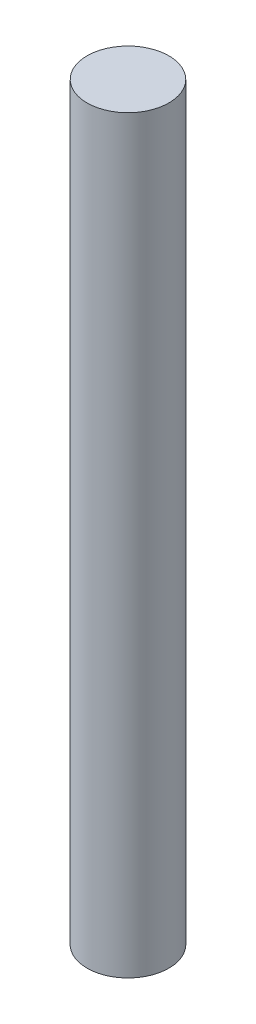
ISO-10303-21;
HEADER;
FILE_DESCRIPTION(('STEP AP214'),'2;1');
FILE_NAME('part.step','',(''),(''),'','','');
FILE_SCHEMA(('AUTOMOTIVE_DESIGN { 1 0 10303 214 1 1 1 1 }'));
ENDSEC;
DATA;
#1=APPLICATION_CONTEXT('core data for automotive mechanical design processes');
#2=APPLICATION_PROTOCOL_DEFINITION('international standard','automotive_design',2000,#1);
#3=PRODUCT_CONTEXT('',#1,'mechanical');
#4=PRODUCT('Part','Part','',(#3));
#5=PRODUCT_RELATED_PRODUCT_CATEGORY('part','',(#4));
#6=PRODUCT_DEFINITION_FORMATION('','',#4);
#7=PRODUCT_DEFINITION_CONTEXT('part definition',#1,'design');
#8=PRODUCT_DEFINITION('design','',#6,#7);
#9=PRODUCT_DEFINITION_SHAPE('','',#8);
#10=(LENGTH_UNIT() NAMED_UNIT(*) SI_UNIT(.MILLI.,.METRE.));
#11=(NAMED_UNIT(*) PLANE_ANGLE_UNIT() SI_UNIT($,.RADIAN.));
#12=(NAMED_UNIT(*) SI_UNIT($,.STERADIAN.) SOLID_ANGLE_UNIT());
#13=UNCERTAINTY_MEASURE_WITH_UNIT(LENGTH_MEASURE(1.E-05),#10,'distance_accuracy_value','');
#14=(GEOMETRIC_REPRESENTATION_CONTEXT(3) GLOBAL_UNCERTAINTY_ASSIGNED_CONTEXT((#13)) GLOBAL_UNIT_ASSIGNED_CONTEXT((#10,
#11,#12)) REPRESENTATION_CONTEXT('',''));
#15=CARTESIAN_POINT('',(0.,0.,0.));
#16=DIRECTION('',(0.,0.,1.));
#17=DIRECTION('',(1.,0.,0.));
#18=AXIS2_PLACEMENT_3D('',#15,#16,#17);
#19=CARTESIAN_POINT('',(0.,13.75,0.));
#20=DIRECTION('',(0.,-1.,0.));
#21=DIRECTION('',(0.,0.,-1.));
#22=AXIS2_PLACEMENT_3D('',#19,#20,#21);
#23=CYLINDRICAL_SURFACE('',#22,1.5);
#24=CARTESIAN_POINT('',(0.,13.75,0.));
#25=DIRECTION('',(0.,1.,0.));
#26=DIRECTION('',(0.,0.,1.));
#27=AXIS2_PLACEMENT_3D('',#24,#25,#26);
#28=CIRCLE('',#27,1.5);
#29=CARTESIAN_POINT('',(0.,13.75,1.5));
#30=VERTEX_POINT('',#29);
#31=EDGE_CURVE('E10',#30,#30,#28,.T.);
#32=ORIENTED_EDGE('',*,*,#31,.F.);
#33=EDGE_LOOP('',(#32));
#34=FACE_BOUND('',#33,.T.);
#35=CARTESIAN_POINT('',(0.,-13.75,0.));
#36=DIRECTION('',(0.,1.,0.));
#37=DIRECTION('',(0.,0.,1.));
#38=AXIS2_PLACEMENT_3D('',#35,#36,#37);
#39=CIRCLE('',#38,1.5);
#40=CARTESIAN_POINT('',(0.,-13.75,1.5));
#41=VERTEX_POINT('',#40);
#42=EDGE_CURVE('E34',#41,#41,#39,.T.);
#43=ORIENTED_EDGE('',*,*,#42,.T.);
#44=EDGE_LOOP('',(#43));
#45=FACE_BOUND('',#44,.T.);
#46=ADVANCED_FACE('F31',(#34,#45),#23,.T.);
#47=CARTESIAN_POINT('',(0.,13.75,0.));
#48=DIRECTION('',(0.,1.,0.));
#49=DIRECTION('',(0.,0.,1.));
#50=AXIS2_PLACEMENT_3D('',#47,#48,#49);
#51=PLANE('',#50);
#52=ORIENTED_EDGE('',*,*,#31,.T.);
#53=EDGE_LOOP('',(#52));
#54=FACE_BOUND('',#53,.T.);
#55=ADVANCED_FACE('F46',(#54),#51,.T.);
#56=CARTESIAN_POINT('',(0.,-13.75,0.));
#57=DIRECTION('',(0.,1.,0.));
#58=DIRECTION('',(0.,0.,1.));
#59=AXIS2_PLACEMENT_3D('',#56,#57,#58);
#60=PLANE('',#59);
#61=ORIENTED_EDGE('',*,*,#42,.F.);
#62=EDGE_LOOP('',(#61));
#63=FACE_BOUND('',#62,.T.);
#64=ADVANCED_FACE('F44',(#63),#60,.F.);
#65=CLOSED_SHELL('',(#46,#55,#64));
#66=MANIFOLD_SOLID_BREP('B2',#65);
#67=ADVANCED_BREP_SHAPE_REPRESENTATION('',(#18,#66),#14);
#68=SHAPE_DEFINITION_REPRESENTATION(#9,#67);
ENDSEC;
END-ISO-10303-21;
